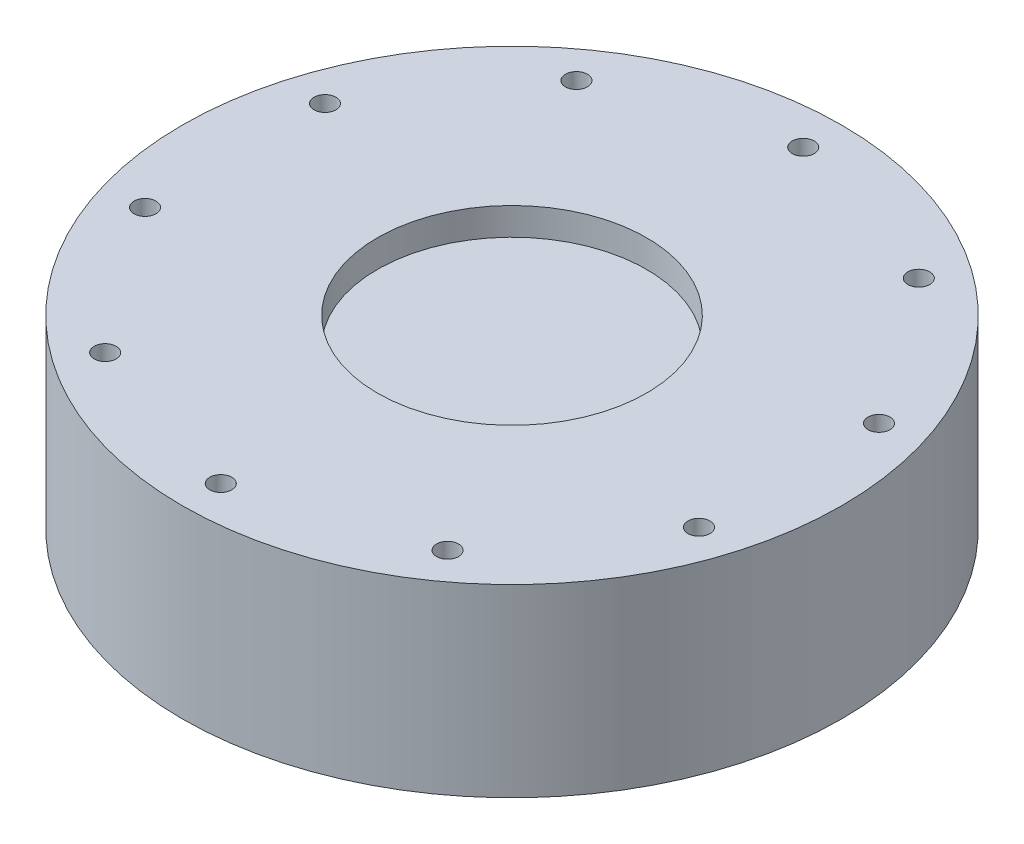
ISO-10303-21;
HEADER;
FILE_DESCRIPTION(('STEP AP214'),'2;1');
FILE_NAME('part.step','',(''),(''),'','','');
FILE_SCHEMA(('AUTOMOTIVE_DESIGN { 1 0 10303 214 1 1 1 1 }'));
ENDSEC;
DATA;
#1=APPLICATION_CONTEXT('core data for automotive mechanical design processes');
#2=APPLICATION_PROTOCOL_DEFINITION('international standard','automotive_design',2000,#1);
#3=PRODUCT_CONTEXT('',#1,'mechanical');
#4=PRODUCT('Part','Part','',(#3));
#5=PRODUCT_RELATED_PRODUCT_CATEGORY('part','',(#4));
#6=PRODUCT_DEFINITION_FORMATION('','',#4);
#7=PRODUCT_DEFINITION_CONTEXT('part definition',#1,'design');
#8=PRODUCT_DEFINITION('design','',#6,#7);
#9=PRODUCT_DEFINITION_SHAPE('','',#8);
#10=(LENGTH_UNIT() NAMED_UNIT(*) SI_UNIT(.MILLI.,.METRE.));
#11=(NAMED_UNIT(*) PLANE_ANGLE_UNIT() SI_UNIT($,.RADIAN.));
#12=(NAMED_UNIT(*) SI_UNIT($,.STERADIAN.) SOLID_ANGLE_UNIT());
#13=UNCERTAINTY_MEASURE_WITH_UNIT(LENGTH_MEASURE(1.E-05),#10,'distance_accuracy_value','');
#14=(GEOMETRIC_REPRESENTATION_CONTEXT(3) GLOBAL_UNCERTAINTY_ASSIGNED_CONTEXT((#13)) GLOBAL_UNIT_ASSIGNED_CONTEXT((#10,
#11,#12)) REPRESENTATION_CONTEXT('',''));
#15=CARTESIAN_POINT('',(0.,0.,0.));
#16=DIRECTION('',(0.,0.,1.));
#17=DIRECTION('',(1.,0.,0.));
#18=AXIS2_PLACEMENT_3D('',#15,#16,#17);
#19=CARTESIAN_POINT('',(0.,33.6,0.));
#20=DIRECTION('',(0.,-1.,0.));
#21=DIRECTION('',(0.,0.,-1.));
#22=AXIS2_PLACEMENT_3D('',#19,#20,#21);
#23=CYLINDRICAL_SURFACE('',#22,60.);
#24=CARTESIAN_POINT('',(0.,33.6,0.));
#25=DIRECTION('',(0.,1.,0.));
#26=DIRECTION('',(0.,0.,1.));
#27=AXIS2_PLACEMENT_3D('',#24,#25,#26);
#28=CIRCLE('',#27,60.);
#29=CARTESIAN_POINT('',(0.,33.6,60.));
#30=VERTEX_POINT('',#29);
#31=EDGE_CURVE('E49',#30,#30,#28,.T.);
#32=ORIENTED_EDGE('',*,*,#31,.F.);
#33=EDGE_LOOP('',(#32));
#34=FACE_BOUND('',#33,.T.);
#35=CARTESIAN_POINT('',(0.,0.,0.));
#36=DIRECTION('',(0.,1.,0.));
#37=DIRECTION('',(0.,0.,1.));
#38=AXIS2_PLACEMENT_3D('',#35,#36,#37);
#39=CIRCLE('',#38,60.);
#40=CARTESIAN_POINT('',(0.,0.,60.));
#41=VERTEX_POINT('',#40);
#42=EDGE_CURVE('E150',#41,#41,#39,.T.);
#43=ORIENTED_EDGE('',*,*,#42,.T.);
#44=EDGE_LOOP('',(#43));
#45=FACE_BOUND('',#44,.T.);
#46=ADVANCED_FACE('F42',(#34,#45),#23,.T.);
#47=CARTESIAN_POINT('',(0.,33.6,0.));
#48=DIRECTION('',(0.,1.,0.));
#49=DIRECTION('',(0.,0.,1.));
#50=AXIS2_PLACEMENT_3D('',#47,#48,#49);
#51=PLANE('',#50);
#52=CARTESIAN_POINT('',(0.,33.6,0.));
#53=DIRECTION('',(0.,1.,0.));
#54=DIRECTION('',(0.,0.,1.));
#55=AXIS2_PLACEMENT_3D('',#52,#53,#54);
#56=CIRCLE('',#55,24.5);
#57=CARTESIAN_POINT('',(0.,33.6,24.5));
#58=VERTEX_POINT('',#57);
#59=EDGE_CURVE('E84',#58,#58,#56,.T.);
#60=ORIENTED_EDGE('',*,*,#59,.F.);
#61=EDGE_LOOP('',(#60));
#62=FACE_BOUND('',#61,.T.);
#63=CARTESIAN_POINT('',(0.,33.6,-53.));
#64=DIRECTION('',(0.,1.,0.));
#65=DIRECTION('',(0.,0.,1.));
#66=AXIS2_PLACEMENT_3D('',#63,#64,#65);
#67=CIRCLE('',#66,2.);
#68=CARTESIAN_POINT('',(0.,33.6,-51.));
#69=VERTEX_POINT('',#68);
#70=EDGE_CURVE('E147',#69,#69,#67,.T.);
#71=ORIENTED_EDGE('',*,*,#70,.F.);
#72=EDGE_LOOP('',(#71));
#73=FACE_BOUND('',#72,.T.);
#74=CARTESIAN_POINT('',(-31.1526183715011,33.6,-42.8779007018722));
#75=DIRECTION('',(0.,1.,0.));
#76=DIRECTION('',(0.,0.,1.));
#77=AXIS2_PLACEMENT_3D('',#74,#75,#76);
#78=CIRCLE('',#77,2.00000000000068);
#79=CARTESIAN_POINT('',(-31.1526183715011,33.6,-40.8779007018715));
#80=VERTEX_POINT('',#79);
#81=EDGE_CURVE('E144',#80,#80,#78,.T.);
#82=ORIENTED_EDGE('',*,*,#81,.F.);
#83=EDGE_LOOP('',(#82));
#84=FACE_BOUND('',#83,.T.);
#85=CARTESIAN_POINT('',(-50.4059953636432,33.6,-16.3779007018722));
#86=DIRECTION('',(0.,1.,0.));
#87=DIRECTION('',(0.,0.,1.));
#88=AXIS2_PLACEMENT_3D('',#85,#86,#87);
#89=CIRCLE('',#88,2.00000000000059);
#90=CARTESIAN_POINT('',(-50.4059953636432,33.6,-14.3779007018716));
#91=VERTEX_POINT('',#90);
#92=EDGE_CURVE('E141',#91,#91,#89,.T.);
#93=ORIENTED_EDGE('',*,*,#92,.F.);
#94=EDGE_LOOP('',(#93));
#95=FACE_BOUND('',#94,.T.);
#96=CARTESIAN_POINT('',(-50.4059953636432,33.6,16.3779007018722));
#97=DIRECTION('',(0.,1.,0.));
#98=DIRECTION('',(0.,0.,1.));
#99=AXIS2_PLACEMENT_3D('',#96,#97,#98);
#100=CIRCLE('',#99,2.00000000000049);
#101=CARTESIAN_POINT('',(-50.4059953636432,33.6,18.3779007018727));
#102=VERTEX_POINT('',#101);
#103=EDGE_CURVE('E138',#102,#102,#100,.T.);
#104=ORIENTED_EDGE('',*,*,#103,.F.);
#105=EDGE_LOOP('',(#104));
#106=FACE_BOUND('',#105,.T.);
#107=CARTESIAN_POINT('',(-31.1526183715011,33.6,42.8779007018722));
#108=DIRECTION('',(0.,1.,0.));
#109=DIRECTION('',(0.,0.,1.));
#110=AXIS2_PLACEMENT_3D('',#107,#108,#109);
#111=CIRCLE('',#110,2.00000000000044);
#112=CARTESIAN_POINT('',(-31.1526183715011,33.6,44.8779007018727));
#113=VERTEX_POINT('',#112);
#114=EDGE_CURVE('E135',#113,#113,#111,.T.);
#115=ORIENTED_EDGE('',*,*,#114,.F.);
#116=EDGE_LOOP('',(#115));
#117=FACE_BOUND('',#116,.T.);
#118=CARTESIAN_POINT('',(0.,33.6,53.));
#119=DIRECTION('',(0.,1.,0.));
#120=DIRECTION('',(0.,0.,1.));
#121=AXIS2_PLACEMENT_3D('',#118,#119,#120);
#122=CIRCLE('',#121,2.00000000000035);
#123=CARTESIAN_POINT('',(0.,33.6,55.0000000000004));
#124=VERTEX_POINT('',#123);
#125=EDGE_CURVE('E132',#124,#124,#122,.T.);
#126=ORIENTED_EDGE('',*,*,#125,.F.);
#127=EDGE_LOOP('',(#126));
#128=FACE_BOUND('',#127,.T.);
#129=CARTESIAN_POINT('',(31.1526183715011,33.6,42.8779007018722));
#130=DIRECTION('',(0.,1.,0.));
#131=DIRECTION('',(0.,0.,1.));
#132=AXIS2_PLACEMENT_3D('',#129,#130,#131);
#133=CIRCLE('',#132,2.00000000000028);
#134=CARTESIAN_POINT('',(31.1526183715011,33.6,44.8779007018725));
#135=VERTEX_POINT('',#134);
#136=EDGE_CURVE('E129',#135,#135,#133,.T.);
#137=ORIENTED_EDGE('',*,*,#136,.F.);
#138=EDGE_LOOP('',(#137));
#139=FACE_BOUND('',#138,.T.);
#140=CARTESIAN_POINT('',(50.4059953636432,33.6,16.3779007018722));
#141=DIRECTION('',(0.,1.,0.));
#142=DIRECTION('',(0.,0.,1.));
#143=AXIS2_PLACEMENT_3D('',#140,#141,#142);
#144=CIRCLE('',#143,2.00000000000021);
#145=CARTESIAN_POINT('',(50.4059953636432,33.6,18.3779007018724));
#146=VERTEX_POINT('',#145);
#147=EDGE_CURVE('E126',#146,#146,#144,.T.);
#148=ORIENTED_EDGE('',*,*,#147,.F.);
#149=EDGE_LOOP('',(#148));
#150=FACE_BOUND('',#149,.T.);
#151=CARTESIAN_POINT('',(50.4059953636432,33.6,-16.3779007018722));
#152=DIRECTION('',(0.,1.,0.));
#153=DIRECTION('',(0.,0.,1.));
#154=AXIS2_PLACEMENT_3D('',#151,#152,#153);
#155=CIRCLE('',#154,2.00000000000015);
#156=CARTESIAN_POINT('',(50.4059953636432,33.6,-14.3779007018721));
#157=VERTEX_POINT('',#156);
#158=EDGE_CURVE('E123',#157,#157,#155,.T.);
#159=ORIENTED_EDGE('',*,*,#158,.F.);
#160=EDGE_LOOP('',(#159));
#161=FACE_BOUND('',#160,.T.);
#162=CARTESIAN_POINT('',(31.1526183715011,33.6,-42.8779007018722));
#163=DIRECTION('',(0.,1.,0.));
#164=DIRECTION('',(0.,0.,1.));
#165=AXIS2_PLACEMENT_3D('',#162,#163,#164);
#166=CIRCLE('',#165,2.00000000000008);
#167=CARTESIAN_POINT('',(31.1526183715011,33.6,-40.8779007018721));
#168=VERTEX_POINT('',#167);
#169=EDGE_CURVE('E94',#168,#168,#166,.T.);
#170=ORIENTED_EDGE('',*,*,#169,.F.);
#171=EDGE_LOOP('',(#170));
#172=FACE_BOUND('',#171,.T.);
#173=ORIENTED_EDGE('',*,*,#31,.T.);
#174=EDGE_LOOP('',(#173));
#175=FACE_BOUND('',#174,.T.);
#176=ADVANCED_FACE('F158',(#62,#73,#84,#95,#106,#117,#128,#139,#150,#161,#172,#175),#51,.T.);
#177=CARTESIAN_POINT('',(0.,0.,0.));
#178=DIRECTION('',(0.,1.,0.));
#179=DIRECTION('',(0.,0.,1.));
#180=AXIS2_PLACEMENT_3D('',#177,#178,#179);
#181=PLANE('',#180);
#182=CARTESIAN_POINT('',(0.,0.,0.));
#183=DIRECTION('',(0.,1.,0.));
#184=DIRECTION('',(0.,0.,1.));
#185=AXIS2_PLACEMENT_3D('',#182,#183,#184);
#186=CIRCLE('',#185,42.5);
#187=CARTESIAN_POINT('',(14.2,0.,-40.0575835516822));
#188=VERTEX_POINT('',#187);
#189=CARTESIAN_POINT('',(-14.2,0.,-40.0575835516822));
#190=VERTEX_POINT('',#189);
#191=EDGE_CURVE('E11',#188,#190,#186,.F.);
#192=ORIENTED_EDGE('',*,*,#191,.F.);
#193=DIRECTION('',(-1.,0.,0.));
#194=VECTOR('',#193,1.);
#195=CARTESIAN_POINT('',(-14.2,0.,-40.0575835516822));
#196=LINE('',#195,#194);
#197=EDGE_CURVE('E70',#188,#190,#196,.T.);
#198=ORIENTED_EDGE('',*,*,#197,.T.);
#199=EDGE_LOOP('',(#192,#198));
#200=FACE_BOUND('',#199,.T.);
#201=CARTESIAN_POINT('',(0.,0.,-53.));
#202=DIRECTION('',(0.,1.,0.));
#203=DIRECTION('',(0.,0.,1.));
#204=AXIS2_PLACEMENT_3D('',#201,#202,#203);
#205=CIRCLE('',#204,2.);
#206=CARTESIAN_POINT('',(0.,0.,-51.));
#207=VERTEX_POINT('',#206);
#208=EDGE_CURVE('E91',#207,#207,#205,.T.);
#209=ORIENTED_EDGE('',*,*,#208,.T.);
#210=EDGE_LOOP('',(#209));
#211=FACE_BOUND('',#210,.T.);
#212=CARTESIAN_POINT('',(-31.1526183715011,0.,-42.8779007018722));
#213=DIRECTION('',(0.,1.,0.));
#214=DIRECTION('',(0.,0.,1.));
#215=AXIS2_PLACEMENT_3D('',#212,#213,#214);
#216=CIRCLE('',#215,2.00000000000068);
#217=CARTESIAN_POINT('',(-31.1526183715011,0.,-40.8779007018715));
#218=VERTEX_POINT('',#217);
#219=EDGE_CURVE('E88',#218,#218,#216,.T.);
#220=ORIENTED_EDGE('',*,*,#219,.T.);
#221=EDGE_LOOP('',(#220));
#222=FACE_BOUND('',#221,.T.);
#223=CARTESIAN_POINT('',(-50.4059953636432,0.,-16.3779007018722));
#224=DIRECTION('',(0.,1.,0.));
#225=DIRECTION('',(0.,0.,1.));
#226=AXIS2_PLACEMENT_3D('',#223,#224,#225);
#227=CIRCLE('',#226,2.00000000000059);
#228=CARTESIAN_POINT('',(-50.4059953636432,0.,-14.3779007018716));
#229=VERTEX_POINT('',#228);
#230=EDGE_CURVE('E98',#229,#229,#227,.T.);
#231=ORIENTED_EDGE('',*,*,#230,.T.);
#232=EDGE_LOOP('',(#231));
#233=FACE_BOUND('',#232,.T.);
#234=CARTESIAN_POINT('',(-50.4059953636432,0.,16.3779007018722));
#235=DIRECTION('',(0.,1.,0.));
#236=DIRECTION('',(0.,0.,1.));
#237=AXIS2_PLACEMENT_3D('',#234,#235,#236);
#238=CIRCLE('',#237,2.00000000000049);
#239=CARTESIAN_POINT('',(-50.4059953636432,0.,18.3779007018727));
#240=VERTEX_POINT('',#239);
#241=EDGE_CURVE('E116',#240,#240,#238,.T.);
#242=ORIENTED_EDGE('',*,*,#241,.T.);
#243=EDGE_LOOP('',(#242));
#244=FACE_BOUND('',#243,.T.);
#245=CARTESIAN_POINT('',(-31.1526183715011,0.,42.8779007018722));
#246=DIRECTION('',(0.,1.,0.));
#247=DIRECTION('',(0.,0.,1.));
#248=AXIS2_PLACEMENT_3D('',#245,#246,#247);
#249=CIRCLE('',#248,2.00000000000044);
#250=CARTESIAN_POINT('',(-31.1526183715011,0.,44.8779007018727));
#251=VERTEX_POINT('',#250);
#252=EDGE_CURVE('E113',#251,#251,#249,.T.);
#253=ORIENTED_EDGE('',*,*,#252,.T.);
#254=EDGE_LOOP('',(#253));
#255=FACE_BOUND('',#254,.T.);
#256=CARTESIAN_POINT('',(0.,0.,53.));
#257=DIRECTION('',(0.,1.,0.));
#258=DIRECTION('',(0.,0.,1.));
#259=AXIS2_PLACEMENT_3D('',#256,#257,#258);
#260=CIRCLE('',#259,2.00000000000035);
#261=CARTESIAN_POINT('',(0.,0.,55.0000000000004));
#262=VERTEX_POINT('',#261);
#263=EDGE_CURVE('E110',#262,#262,#260,.T.);
#264=ORIENTED_EDGE('',*,*,#263,.T.);
#265=EDGE_LOOP('',(#264));
#266=FACE_BOUND('',#265,.T.);
#267=CARTESIAN_POINT('',(31.1526183715011,0.,42.8779007018722));
#268=DIRECTION('',(0.,1.,0.));
#269=DIRECTION('',(0.,0.,1.));
#270=AXIS2_PLACEMENT_3D('',#267,#268,#269);
#271=CIRCLE('',#270,2.00000000000028);
#272=CARTESIAN_POINT('',(31.1526183715011,0.,44.8779007018725));
#273=VERTEX_POINT('',#272);
#274=EDGE_CURVE('E107',#273,#273,#271,.T.);
#275=ORIENTED_EDGE('',*,*,#274,.T.);
#276=EDGE_LOOP('',(#275));
#277=FACE_BOUND('',#276,.T.);
#278=CARTESIAN_POINT('',(50.4059953636432,0.,16.3779007018722));
#279=DIRECTION('',(0.,1.,0.));
#280=DIRECTION('',(0.,0.,1.));
#281=AXIS2_PLACEMENT_3D('',#278,#279,#280);
#282=CIRCLE('',#281,2.00000000000021);
#283=CARTESIAN_POINT('',(50.4059953636432,0.,18.3779007018724));
#284=VERTEX_POINT('',#283);
#285=EDGE_CURVE('E104',#284,#284,#282,.T.);
#286=ORIENTED_EDGE('',*,*,#285,.T.);
#287=EDGE_LOOP('',(#286));
#288=FACE_BOUND('',#287,.T.);
#289=CARTESIAN_POINT('',(50.4059953636432,0.,-16.3779007018722));
#290=DIRECTION('',(0.,1.,0.));
#291=DIRECTION('',(0.,0.,1.));
#292=AXIS2_PLACEMENT_3D('',#289,#290,#291);
#293=CIRCLE('',#292,2.00000000000015);
#294=CARTESIAN_POINT('',(50.4059953636432,0.,-14.3779007018721));
#295=VERTEX_POINT('',#294);
#296=EDGE_CURVE('E101',#295,#295,#293,.T.);
#297=ORIENTED_EDGE('',*,*,#296,.T.);
#298=EDGE_LOOP('',(#297));
#299=FACE_BOUND('',#298,.T.);
#300=CARTESIAN_POINT('',(31.1526183715011,0.,-42.8779007018722));
#301=DIRECTION('',(0.,1.,0.));
#302=DIRECTION('',(0.,0.,1.));
#303=AXIS2_PLACEMENT_3D('',#300,#301,#302);
#304=CIRCLE('',#303,2.00000000000008);
#305=CARTESIAN_POINT('',(31.1526183715011,0.,-40.8779007018721));
#306=VERTEX_POINT('',#305);
#307=EDGE_CURVE('E95',#306,#306,#304,.T.);
#308=ORIENTED_EDGE('',*,*,#307,.T.);
#309=EDGE_LOOP('',(#308));
#310=FACE_BOUND('',#309,.T.);
#311=ORIENTED_EDGE('',*,*,#42,.F.);
#312=EDGE_LOOP('',(#311));
#313=FACE_BOUND('',#312,.T.);
#314=ADVANCED_FACE('F71',(#200,#211,#222,#233,#244,#255,#266,#277,#288,#299,#310,#313),#181,.F.);
#315=CARTESIAN_POINT('',(31.1526183715011,0.,-42.8779007018722));
#316=DIRECTION('',(0.,1.,0.));
#317=DIRECTION('',(0.,0.,1.));
#318=AXIS2_PLACEMENT_3D('',#315,#316,#317);
#319=CYLINDRICAL_SURFACE('',#318,2.00000000000008);
#320=ORIENTED_EDGE('',*,*,#169,.T.);
#321=EDGE_LOOP('',(#320));
#322=FACE_BOUND('',#321,.T.);
#323=ORIENTED_EDGE('',*,*,#307,.F.);
#324=EDGE_LOOP('',(#323));
#325=FACE_BOUND('',#324,.T.);
#326=ADVANCED_FACE('F157',(#322,#325),#319,.F.);
#327=CARTESIAN_POINT('',(50.4059953636432,0.,-16.3779007018722));
#328=DIRECTION('',(0.,1.,0.));
#329=DIRECTION('',(0.,0.,1.));
#330=AXIS2_PLACEMENT_3D('',#327,#328,#329);
#331=CYLINDRICAL_SURFACE('',#330,2.00000000000015);
#332=ORIENTED_EDGE('',*,*,#158,.T.);
#333=EDGE_LOOP('',(#332));
#334=FACE_BOUND('',#333,.T.);
#335=ORIENTED_EDGE('',*,*,#296,.F.);
#336=EDGE_LOOP('',(#335));
#337=FACE_BOUND('',#336,.T.);
#338=ADVANCED_FACE('F163',(#334,#337),#331,.F.);
#339=CARTESIAN_POINT('',(50.4059953636432,0.,16.3779007018722));
#340=DIRECTION('',(0.,1.,0.));
#341=DIRECTION('',(0.,0.,1.));
#342=AXIS2_PLACEMENT_3D('',#339,#340,#341);
#343=CYLINDRICAL_SURFACE('',#342,2.00000000000021);
#344=ORIENTED_EDGE('',*,*,#147,.T.);
#345=EDGE_LOOP('',(#344));
#346=FACE_BOUND('',#345,.T.);
#347=ORIENTED_EDGE('',*,*,#285,.F.);
#348=EDGE_LOOP('',(#347));
#349=FACE_BOUND('',#348,.T.);
#350=ADVANCED_FACE('F312',(#346,#349),#343,.F.);
#351=CARTESIAN_POINT('',(31.1526183715011,0.,42.8779007018722));
#352=DIRECTION('',(0.,1.,0.));
#353=DIRECTION('',(0.,0.,1.));
#354=AXIS2_PLACEMENT_3D('',#351,#352,#353);
#355=CYLINDRICAL_SURFACE('',#354,2.00000000000028);
#356=ORIENTED_EDGE('',*,*,#136,.T.);
#357=EDGE_LOOP('',(#356));
#358=FACE_BOUND('',#357,.T.);
#359=ORIENTED_EDGE('',*,*,#274,.F.);
#360=EDGE_LOOP('',(#359));
#361=FACE_BOUND('',#360,.T.);
#362=ADVANCED_FACE('F302',(#358,#361),#355,.F.);
#363=CARTESIAN_POINT('',(0.,0.,53.));
#364=DIRECTION('',(0.,1.,0.));
#365=DIRECTION('',(0.,0.,1.));
#366=AXIS2_PLACEMENT_3D('',#363,#364,#365);
#367=CYLINDRICAL_SURFACE('',#366,2.00000000000035);
#368=ORIENTED_EDGE('',*,*,#125,.T.);
#369=EDGE_LOOP('',(#368));
#370=FACE_BOUND('',#369,.T.);
#371=ORIENTED_EDGE('',*,*,#263,.F.);
#372=EDGE_LOOP('',(#371));
#373=FACE_BOUND('',#372,.T.);
#374=ADVANCED_FACE('F292',(#370,#373),#367,.F.);
#375=CARTESIAN_POINT('',(-31.1526183715011,0.,42.8779007018722));
#376=DIRECTION('',(0.,1.,0.));
#377=DIRECTION('',(0.,0.,1.));
#378=AXIS2_PLACEMENT_3D('',#375,#376,#377);
#379=CYLINDRICAL_SURFACE('',#378,2.00000000000044);
#380=ORIENTED_EDGE('',*,*,#114,.T.);
#381=EDGE_LOOP('',(#380));
#382=FACE_BOUND('',#381,.T.);
#383=ORIENTED_EDGE('',*,*,#252,.F.);
#384=EDGE_LOOP('',(#383));
#385=FACE_BOUND('',#384,.T.);
#386=ADVANCED_FACE('F282',(#382,#385),#379,.F.);
#387=CARTESIAN_POINT('',(-50.4059953636432,0.,16.3779007018722));
#388=DIRECTION('',(0.,1.,0.));
#389=DIRECTION('',(0.,0.,1.));
#390=AXIS2_PLACEMENT_3D('',#387,#388,#389);
#391=CYLINDRICAL_SURFACE('',#390,2.00000000000049);
#392=ORIENTED_EDGE('',*,*,#103,.T.);
#393=EDGE_LOOP('',(#392));
#394=FACE_BOUND('',#393,.T.);
#395=ORIENTED_EDGE('',*,*,#241,.F.);
#396=EDGE_LOOP('',(#395));
#397=FACE_BOUND('',#396,.T.);
#398=ADVANCED_FACE('F272',(#394,#397),#391,.F.);
#399=CARTESIAN_POINT('',(-50.4059953636432,0.,-16.3779007018722));
#400=DIRECTION('',(0.,1.,0.));
#401=DIRECTION('',(0.,0.,1.));
#402=AXIS2_PLACEMENT_3D('',#399,#400,#401);
#403=CYLINDRICAL_SURFACE('',#402,2.00000000000059);
#404=ORIENTED_EDGE('',*,*,#92,.T.);
#405=EDGE_LOOP('',(#404));
#406=FACE_BOUND('',#405,.T.);
#407=ORIENTED_EDGE('',*,*,#230,.F.);
#408=EDGE_LOOP('',(#407));
#409=FACE_BOUND('',#408,.T.);
#410=ADVANCED_FACE('F263',(#406,#409),#403,.F.);
#411=CARTESIAN_POINT('',(-31.1526183715011,0.,-42.8779007018722));
#412=DIRECTION('',(0.,1.,0.));
#413=DIRECTION('',(0.,0.,1.));
#414=AXIS2_PLACEMENT_3D('',#411,#412,#413);
#415=CYLINDRICAL_SURFACE('',#414,2.00000000000068);
#416=ORIENTED_EDGE('',*,*,#81,.T.);
#417=EDGE_LOOP('',(#416));
#418=FACE_BOUND('',#417,.T.);
#419=ORIENTED_EDGE('',*,*,#219,.F.);
#420=EDGE_LOOP('',(#419));
#421=FACE_BOUND('',#420,.T.);
#422=ADVANCED_FACE('F254',(#418,#421),#415,.F.);
#423=CARTESIAN_POINT('',(0.,0.,-53.));
#424=DIRECTION('',(0.,1.,0.));
#425=DIRECTION('',(0.,0.,1.));
#426=AXIS2_PLACEMENT_3D('',#423,#424,#425);
#427=CYLINDRICAL_SURFACE('',#426,2.);
#428=ORIENTED_EDGE('',*,*,#70,.T.);
#429=EDGE_LOOP('',(#428));
#430=FACE_BOUND('',#429,.T.);
#431=ORIENTED_EDGE('',*,*,#208,.F.);
#432=EDGE_LOOP('',(#431));
#433=FACE_BOUND('',#432,.T.);
#434=ADVANCED_FACE('F187',(#430,#433),#427,.F.);
#435=CARTESIAN_POINT('',(0.,28.6,0.));
#436=DIRECTION('',(0.,1.,0.));
#437=DIRECTION('',(0.,0.,1.));
#438=AXIS2_PLACEMENT_3D('',#435,#436,#437);
#439=CYLINDRICAL_SURFACE('',#438,24.5);
#440=CARTESIAN_POINT('',(0.,28.6,0.));
#441=DIRECTION('',(0.,1.,0.));
#442=DIRECTION('',(0.,0.,1.));
#443=AXIS2_PLACEMENT_3D('',#440,#441,#442);
#444=CIRCLE('',#443,24.5);
#445=CARTESIAN_POINT('',(0.,28.6,24.5));
#446=VERTEX_POINT('',#445);
#447=EDGE_CURVE('E85',#446,#446,#444,.T.);
#448=ORIENTED_EDGE('',*,*,#447,.F.);
#449=EDGE_LOOP('',(#448));
#450=FACE_BOUND('',#449,.T.);
#451=ORIENTED_EDGE('',*,*,#59,.T.);
#452=EDGE_LOOP('',(#451));
#453=FACE_BOUND('',#452,.T.);
#454=ADVANCED_FACE('F192',(#450,#453),#439,.F.);
#455=CARTESIAN_POINT('',(0.,28.6,0.));
#456=DIRECTION('',(0.,1.,0.));
#457=DIRECTION('',(0.,0.,1.));
#458=AXIS2_PLACEMENT_3D('',#455,#456,#457);
#459=PLANE('',#458);
#460=ORIENTED_EDGE('',*,*,#447,.T.);
#461=EDGE_LOOP('',(#460));
#462=FACE_BOUND('',#461,.T.);
#463=ADVANCED_FACE('F197',(#462),#459,.T.);
#464=CARTESIAN_POINT('',(0.,-11.5,0.));
#465=DIRECTION('',(0.,1.,0.));
#466=DIRECTION('',(0.,0.,1.));
#467=AXIS2_PLACEMENT_3D('',#464,#465,#466);
#468=CYLINDRICAL_SURFACE('',#467,42.5);
#469=CARTESIAN_POINT('',(0.,-11.5,0.));
#470=DIRECTION('',(0.,-1.,0.));
#471=DIRECTION('',(0.,0.,-1.));
#472=AXIS2_PLACEMENT_3D('',#469,#470,#471);
#473=CIRCLE('',#472,42.5);
#474=CARTESIAN_POINT('',(14.2,-11.5,-40.0575835516822));
#475=VERTEX_POINT('',#474);
#476=CARTESIAN_POINT('',(-14.2,-11.5,-40.0575835516822));
#477=VERTEX_POINT('',#476);
#478=EDGE_CURVE('E79',#475,#477,#473,.T.);
#479=ORIENTED_EDGE('',*,*,#478,.F.);
#480=DIRECTION('',(0.,1.,0.));
#481=VECTOR('',#480,1.);
#482=CARTESIAN_POINT('',(14.2,-287.370194992966,-40.0575835516822));
#483=LINE('',#482,#481);
#484=EDGE_CURVE('E55',#475,#188,#483,.T.);
#485=ORIENTED_EDGE('',*,*,#484,.T.);
#486=ORIENTED_EDGE('',*,*,#191,.T.);
#487=DIRECTION('',(0.,1.,0.));
#488=VECTOR('',#487,1.);
#489=CARTESIAN_POINT('',(-14.2,-287.370194992966,-40.0575835516822));
#490=LINE('',#489,#488);
#491=EDGE_CURVE('E60',#477,#190,#490,.T.);
#492=ORIENTED_EDGE('',*,*,#491,.F.);
#493=EDGE_LOOP('',(#479,#485,#486,#492));
#494=FACE_BOUND('',#493,.T.);
#495=ADVANCED_FACE('F67',(#494),#468,.T.);
#496=CARTESIAN_POINT('',(0.,-11.5,0.));
#497=DIRECTION('',(0.,-1.,0.));
#498=DIRECTION('',(0.,0.,-1.));
#499=AXIS2_PLACEMENT_3D('',#496,#497,#498);
#500=PLANE('',#499);
#501=DIRECTION('',(-1.,0.,0.));
#502=VECTOR('',#501,1.);
#503=CARTESIAN_POINT('',(-14.2,-11.5,-40.0575835516822));
#504=LINE('',#503,#502);
#505=EDGE_CURVE('E77',#475,#477,#504,.T.);
#506=ORIENTED_EDGE('',*,*,#505,.F.);
#507=ORIENTED_EDGE('',*,*,#478,.T.);
#508=EDGE_LOOP('',(#506,#507));
#509=FACE_BOUND('',#508,.T.);
#510=ADVANCED_FACE('F224',(#509),#500,.T.);
#511=CARTESIAN_POINT('',(-14.2,-287.370194992966,-40.0575835516822));
#512=DIRECTION('',(0.,0.,-1.));
#513=DIRECTION('',(-1.,0.,0.));
#514=AXIS2_PLACEMENT_3D('',#511,#512,#513);
#515=PLANE('',#514);
#516=ORIENTED_EDGE('',*,*,#484,.F.);
#517=ORIENTED_EDGE('',*,*,#505,.T.);
#518=ORIENTED_EDGE('',*,*,#491,.T.);
#519=ORIENTED_EDGE('',*,*,#197,.F.);
#520=EDGE_LOOP('',(#516,#517,#518,#519));
#521=FACE_BOUND('',#520,.T.);
#522=ADVANCED_FACE('F76',(#521),#515,.T.);
#523=CLOSED_SHELL('',(#46,#176,#314,#326,#338,#350,#362,#374,#386,#398,#410,#422,#434,#454,#463,
#495,#510,#522));
#524=MANIFOLD_SOLID_BREP('B2',#523);
#525=ADVANCED_BREP_SHAPE_REPRESENTATION('',(#18,#524),#14);
#526=SHAPE_DEFINITION_REPRESENTATION(#9,#525);
ENDSEC;
END-ISO-10303-21;
